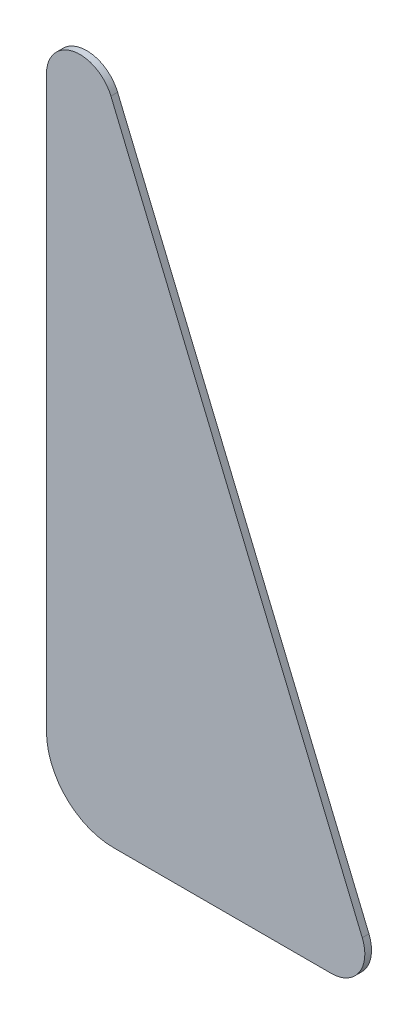
ISO-10303-21;
HEADER;
FILE_DESCRIPTION(('STEP AP214'),'2;1');
FILE_NAME('part.step','',(''),(''),'','','');
FILE_SCHEMA(('AUTOMOTIVE_DESIGN { 1 0 10303 214 1 1 1 1 }'));
ENDSEC;
DATA;
#1=APPLICATION_CONTEXT('core data for automotive mechanical design processes');
#2=APPLICATION_PROTOCOL_DEFINITION('international standard','automotive_design',2000,#1);
#3=PRODUCT_CONTEXT('',#1,'mechanical');
#4=PRODUCT('Part','Part','',(#3));
#5=PRODUCT_RELATED_PRODUCT_CATEGORY('part','',(#4));
#6=PRODUCT_DEFINITION_FORMATION('','',#4);
#7=PRODUCT_DEFINITION_CONTEXT('part definition',#1,'design');
#8=PRODUCT_DEFINITION('design','',#6,#7);
#9=PRODUCT_DEFINITION_SHAPE('','',#8);
#10=(LENGTH_UNIT() NAMED_UNIT(*) SI_UNIT(.MILLI.,.METRE.));
#11=(NAMED_UNIT(*) PLANE_ANGLE_UNIT() SI_UNIT($,.RADIAN.));
#12=(NAMED_UNIT(*) SI_UNIT($,.STERADIAN.) SOLID_ANGLE_UNIT());
#13=UNCERTAINTY_MEASURE_WITH_UNIT(LENGTH_MEASURE(1.E-05),#10,'distance_accuracy_value','');
#14=(GEOMETRIC_REPRESENTATION_CONTEXT(3) GLOBAL_UNCERTAINTY_ASSIGNED_CONTEXT((#13)) GLOBAL_UNIT_ASSIGNED_CONTEXT((#10,
#11,#12)) REPRESENTATION_CONTEXT('',''));
#15=CARTESIAN_POINT('',(0.,0.,0.));
#16=DIRECTION('',(0.,0.,1.));
#17=DIRECTION('',(1.,0.,0.));
#18=AXIS2_PLACEMENT_3D('',#15,#16,#17);
#19=CARTESIAN_POINT('',(100.,100.,10.));
#20=DIRECTION('',(0.,0.,-1.));
#21=DIRECTION('',(-1.,0.,0.));
#22=AXIS2_PLACEMENT_3D('',#19,#20,#21);
#23=CYLINDRICAL_SURFACE('',#22,100.);
#24=CARTESIAN_POINT('',(100.,100.,0.));
#25=DIRECTION('',(0.,0.,1.));
#26=DIRECTION('',(1.,0.,0.));
#27=AXIS2_PLACEMENT_3D('',#24,#25,#26);
#28=CIRCLE('',#27,100.);
#29=CARTESIAN_POINT('',(0.,100.000000000001,0.));
#30=VERTEX_POINT('',#29);
#31=CARTESIAN_POINT('',(100.000000000001,0.,0.));
#32=VERTEX_POINT('',#31);
#33=EDGE_CURVE('E120',#30,#32,#28,.T.);
#34=ORIENTED_EDGE('',*,*,#33,.T.);
#35=DIRECTION('',(0.,0.,-1.));
#36=VECTOR('',#35,1.);
#37=CARTESIAN_POINT('',(100.000000000001,0.,10.));
#38=LINE('',#37,#36);
#39=CARTESIAN_POINT('',(100.000000000001,0.,10.));
#40=VERTEX_POINT('',#39);
#41=EDGE_CURVE('E11',#40,#32,#38,.T.);
#42=ORIENTED_EDGE('',*,*,#41,.F.);
#43=CARTESIAN_POINT('',(100.,100.,10.));
#44=DIRECTION('',(0.,0.,1.));
#45=DIRECTION('',(1.,0.,0.));
#46=AXIS2_PLACEMENT_3D('',#43,#44,#45);
#47=CIRCLE('',#46,100.);
#48=CARTESIAN_POINT('',(0.,100.000000000001,10.));
#49=VERTEX_POINT('',#48);
#50=EDGE_CURVE('E130',#49,#40,#47,.T.);
#51=ORIENTED_EDGE('',*,*,#50,.F.);
#52=DIRECTION('',(0.,0.,-1.));
#53=VECTOR('',#52,1.);
#54=CARTESIAN_POINT('',(0.,100.000000000001,10.));
#55=LINE('',#54,#53);
#56=EDGE_CURVE('E116',#49,#30,#55,.T.);
#57=ORIENTED_EDGE('',*,*,#56,.T.);
#58=EDGE_LOOP('',(#34,#42,#51,#57));
#59=FACE_BOUND('',#58,.T.);
#60=ADVANCED_FACE('F36',(#59),#23,.T.);
#61=CARTESIAN_POINT('',(425.,0.,10.));
#62=DIRECTION('',(0.,1.,0.));
#63=DIRECTION('',(-1.,0.,0.));
#64=AXIS2_PLACEMENT_3D('',#61,#62,#63);
#65=PLANE('',#64);
#66=DIRECTION('',(1.,0.,0.));
#67=VECTOR('',#66,1.);
#68=CARTESIAN_POINT('',(425.,0.,0.));
#69=LINE('',#68,#67);
#70=CARTESIAN_POINT('',(425.,0.,0.));
#71=VERTEX_POINT('',#70);
#72=EDGE_CURVE('E123',#32,#71,#69,.T.);
#73=ORIENTED_EDGE('',*,*,#72,.T.);
#74=DIRECTION('',(0.,0.,-1.));
#75=VECTOR('',#74,1.);
#76=CARTESIAN_POINT('',(425.,0.,10.));
#77=LINE('',#76,#75);
#78=CARTESIAN_POINT('',(425.,0.,10.));
#79=VERTEX_POINT('',#78);
#80=EDGE_CURVE('E44',#79,#71,#77,.T.);
#81=ORIENTED_EDGE('',*,*,#80,.F.);
#82=DIRECTION('',(1.,0.,0.));
#83=VECTOR('',#82,1.);
#84=CARTESIAN_POINT('',(425.,0.,10.));
#85=LINE('',#84,#83);
#86=EDGE_CURVE('E89',#40,#79,#85,.T.);
#87=ORIENTED_EDGE('',*,*,#86,.F.);
#88=ORIENTED_EDGE('',*,*,#41,.T.);
#89=EDGE_LOOP('',(#73,#81,#87,#88));
#90=FACE_BOUND('',#89,.T.);
#91=ADVANCED_FACE('F154',(#90),#65,.F.);
#92=CARTESIAN_POINT('',(425.,49.9999999999999,10.));
#93=DIRECTION('',(0.,0.,-1.));
#94=DIRECTION('',(-1.,0.,0.));
#95=AXIS2_PLACEMENT_3D('',#92,#93,#94);
#96=CYLINDRICAL_SURFACE('',#95,50.);
#97=CARTESIAN_POINT('',(425.,49.9999999999999,0.));
#98=DIRECTION('',(0.,0.,1.));
#99=DIRECTION('',(-1.,0.,0.));
#100=AXIS2_PLACEMENT_3D('',#97,#98,#99);
#101=CIRCLE('',#100,50.);
#102=CARTESIAN_POINT('',(471.153846153846,69.2307692307692,0.));
#103=VERTEX_POINT('',#102);
#104=EDGE_CURVE('E125',#71,#103,#101,.T.);
#105=ORIENTED_EDGE('',*,*,#104,.T.);
#106=DIRECTION('',(0.,0.,-1.));
#107=VECTOR('',#106,1.);
#108=CARTESIAN_POINT('',(471.153846153846,69.2307692307692,10.));
#109=LINE('',#108,#107);
#110=CARTESIAN_POINT('',(471.153846153846,69.2307692307692,10.));
#111=VERTEX_POINT('',#110);
#112=EDGE_CURVE('E111',#111,#103,#109,.T.);
#113=ORIENTED_EDGE('',*,*,#112,.F.);
#114=CARTESIAN_POINT('',(425.,49.9999999999999,10.));
#115=DIRECTION('',(0.,0.,1.));
#116=DIRECTION('',(-1.,0.,0.));
#117=AXIS2_PLACEMENT_3D('',#114,#115,#116);
#118=CIRCLE('',#117,50.);
#119=EDGE_CURVE('E102',#79,#111,#118,.T.);
#120=ORIENTED_EDGE('',*,*,#119,.F.);
#121=ORIENTED_EDGE('',*,*,#80,.T.);
#122=EDGE_LOOP('',(#105,#113,#120,#121));
#123=FACE_BOUND('',#122,.T.);
#124=ADVANCED_FACE('F136',(#123),#96,.T.);
#125=CARTESIAN_POINT('',(96.1538461538461,969.230769230769,10.));
#126=DIRECTION('',(-0.923076923076923,-0.384615384615385,0.));
#127=DIRECTION('',(0.384615384615385,-0.923076923076923,0.));
#128=AXIS2_PLACEMENT_3D('',#125,#126,#127);
#129=PLANE('',#128);
#130=DIRECTION('',(-0.384615384615385,0.923076923076923,0.));
#131=VECTOR('',#130,1.);
#132=CARTESIAN_POINT('',(96.1538461538461,969.230769230769,0.));
#133=LINE('',#132,#131);
#134=CARTESIAN_POINT('',(96.1538461538461,969.230769230769,0.));
#135=VERTEX_POINT('',#134);
#136=EDGE_CURVE('E110',#103,#135,#133,.T.);
#137=ORIENTED_EDGE('',*,*,#136,.T.);
#138=DIRECTION('',(0.,0.,-1.));
#139=VECTOR('',#138,1.);
#140=CARTESIAN_POINT('',(96.1538461538461,969.230769230769,10.));
#141=LINE('',#140,#139);
#142=CARTESIAN_POINT('',(96.1538461538461,969.230769230769,10.));
#143=VERTEX_POINT('',#142);
#144=EDGE_CURVE('E107',#143,#135,#141,.T.);
#145=ORIENTED_EDGE('',*,*,#144,.F.);
#146=DIRECTION('',(-0.384615384615385,0.923076923076923,0.));
#147=VECTOR('',#146,1.);
#148=CARTESIAN_POINT('',(96.1538461538461,969.230769230769,10.));
#149=LINE('',#148,#147);
#150=EDGE_CURVE('E96',#111,#143,#149,.T.);
#151=ORIENTED_EDGE('',*,*,#150,.F.);
#152=ORIENTED_EDGE('',*,*,#112,.T.);
#153=EDGE_LOOP('',(#137,#145,#151,#152));
#154=FACE_BOUND('',#153,.T.);
#155=ADVANCED_FACE('F108',(#154),#129,.F.);
#156=CARTESIAN_POINT('',(50.,950.,10.));
#157=DIRECTION('',(0.,0.,-1.));
#158=DIRECTION('',(-1.,0.,0.));
#159=AXIS2_PLACEMENT_3D('',#156,#157,#158);
#160=CYLINDRICAL_SURFACE('',#159,50.);
#161=CARTESIAN_POINT('',(50.,950.,0.));
#162=DIRECTION('',(0.,0.,1.));
#163=DIRECTION('',(-1.,0.,0.));
#164=AXIS2_PLACEMENT_3D('',#161,#162,#163);
#165=CIRCLE('',#164,50.);
#166=CARTESIAN_POINT('',(0.,950.,0.));
#167=VERTEX_POINT('',#166);
#168=EDGE_CURVE('E75',#135,#167,#165,.T.);
#169=ORIENTED_EDGE('',*,*,#168,.T.);
#170=DIRECTION('',(0.,0.,-1.));
#171=VECTOR('',#170,1.);
#172=CARTESIAN_POINT('',(0.,950.,10.));
#173=LINE('',#172,#171);
#174=CARTESIAN_POINT('',(0.,950.,10.));
#175=VERTEX_POINT('',#174);
#176=EDGE_CURVE('E112',#175,#167,#173,.T.);
#177=ORIENTED_EDGE('',*,*,#176,.F.);
#178=CARTESIAN_POINT('',(50.,950.,10.));
#179=DIRECTION('',(0.,0.,1.));
#180=DIRECTION('',(-1.,0.,0.));
#181=AXIS2_PLACEMENT_3D('',#178,#179,#180);
#182=CIRCLE('',#181,50.);
#183=EDGE_CURVE('E100',#143,#175,#182,.T.);
#184=ORIENTED_EDGE('',*,*,#183,.F.);
#185=ORIENTED_EDGE('',*,*,#144,.T.);
#186=EDGE_LOOP('',(#169,#177,#184,#185));
#187=FACE_BOUND('',#186,.T.);
#188=ADVANCED_FACE('F114',(#187),#160,.T.);
#189=CARTESIAN_POINT('',(0.,100.000000000001,10.));
#190=DIRECTION('',(1.,0.,0.));
#191=DIRECTION('',(0.,0.,-1.));
#192=AXIS2_PLACEMENT_3D('',#189,#190,#191);
#193=PLANE('',#192);
#194=DIRECTION('',(0.,-1.,0.));
#195=VECTOR('',#194,1.);
#196=CARTESIAN_POINT('',(0.,100.000000000001,0.));
#197=LINE('',#196,#195);
#198=EDGE_CURVE('E81',#167,#30,#197,.T.);
#199=ORIENTED_EDGE('',*,*,#198,.T.);
#200=ORIENTED_EDGE('',*,*,#56,.F.);
#201=DIRECTION('',(0.,-1.,0.));
#202=VECTOR('',#201,1.);
#203=CARTESIAN_POINT('',(0.,100.000000000001,10.));
#204=LINE('',#203,#202);
#205=EDGE_CURVE('E52',#175,#49,#204,.T.);
#206=ORIENTED_EDGE('',*,*,#205,.F.);
#207=ORIENTED_EDGE('',*,*,#176,.T.);
#208=EDGE_LOOP('',(#199,#200,#206,#207));
#209=FACE_BOUND('',#208,.T.);
#210=ADVANCED_FACE('F143',(#209),#193,.F.);
#211=CARTESIAN_POINT('',(100.,100.,10.));
#212=DIRECTION('',(0.,0.,1.));
#213=DIRECTION('',(1.,0.,0.));
#214=AXIS2_PLACEMENT_3D('',#211,#212,#213);
#215=PLANE('',#214);
#216=ORIENTED_EDGE('',*,*,#50,.T.);
#217=ORIENTED_EDGE('',*,*,#86,.T.);
#218=ORIENTED_EDGE('',*,*,#119,.T.);
#219=ORIENTED_EDGE('',*,*,#150,.T.);
#220=ORIENTED_EDGE('',*,*,#183,.T.);
#221=ORIENTED_EDGE('',*,*,#205,.T.);
#222=EDGE_LOOP('',(#216,#217,#218,#219,#220,#221));
#223=FACE_BOUND('',#222,.T.);
#224=ADVANCED_FACE('F98',(#223),#215,.T.);
#225=CARTESIAN_POINT('',(100.,100.,0.));
#226=DIRECTION('',(0.,0.,1.));
#227=DIRECTION('',(1.,0.,0.));
#228=AXIS2_PLACEMENT_3D('',#225,#226,#227);
#229=PLANE('',#228);
#230=ORIENTED_EDGE('',*,*,#33,.F.);
#231=ORIENTED_EDGE('',*,*,#198,.F.);
#232=ORIENTED_EDGE('',*,*,#168,.F.);
#233=ORIENTED_EDGE('',*,*,#136,.F.);
#234=ORIENTED_EDGE('',*,*,#104,.F.);
#235=ORIENTED_EDGE('',*,*,#72,.F.);
#236=EDGE_LOOP('',(#230,#231,#232,#233,#234,#235));
#237=FACE_BOUND('',#236,.T.);
#238=ADVANCED_FACE('F139',(#237),#229,.F.);
#239=CLOSED_SHELL('',(#60,#91,#124,#155,#188,#210,#224,#238));
#240=MANIFOLD_SOLID_BREP('B2',#239);
#241=ADVANCED_BREP_SHAPE_REPRESENTATION('',(#18,#240),#14);
#242=SHAPE_DEFINITION_REPRESENTATION(#9,#241);
ENDSEC;
END-ISO-10303-21;
